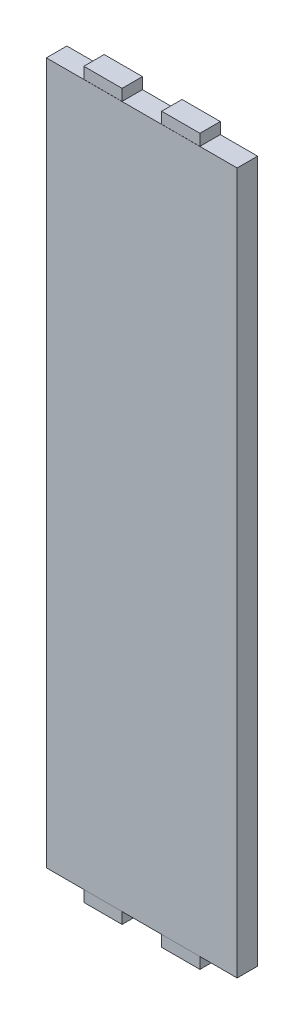
ISO-10303-21;
HEADER;
FILE_DESCRIPTION(('STEP AP214'),'2;1');
FILE_NAME('part.step','',(''),(''),'','','');
FILE_SCHEMA(('AUTOMOTIVE_DESIGN { 1 0 10303 214 1 1 1 1 }'));
ENDSEC;
DATA;
#1=APPLICATION_CONTEXT('core data for automotive mechanical design processes');
#2=APPLICATION_PROTOCOL_DEFINITION('international standard','automotive_design',2000,#1);
#3=PRODUCT_CONTEXT('',#1,'mechanical');
#4=PRODUCT('Part','Part','',(#3));
#5=PRODUCT_RELATED_PRODUCT_CATEGORY('part','',(#4));
#6=PRODUCT_DEFINITION_FORMATION('','',#4);
#7=PRODUCT_DEFINITION_CONTEXT('part definition',#1,'design');
#8=PRODUCT_DEFINITION('design','',#6,#7);
#9=PRODUCT_DEFINITION_SHAPE('','',#8);
#10=(LENGTH_UNIT() NAMED_UNIT(*) SI_UNIT(.MILLI.,.METRE.));
#11=(NAMED_UNIT(*) PLANE_ANGLE_UNIT() SI_UNIT($,.RADIAN.));
#12=(NAMED_UNIT(*) SI_UNIT($,.STERADIAN.) SOLID_ANGLE_UNIT());
#13=UNCERTAINTY_MEASURE_WITH_UNIT(LENGTH_MEASURE(1.E-05),#10,'distance_accuracy_value','');
#14=(GEOMETRIC_REPRESENTATION_CONTEXT(3) GLOBAL_UNCERTAINTY_ASSIGNED_CONTEXT((#13)) GLOBAL_UNIT_ASSIGNED_CONTEXT((#10,
#11,#12)) REPRESENTATION_CONTEXT('',''));
#15=CARTESIAN_POINT('',(0.,0.,0.));
#16=DIRECTION('',(0.,0.,1.));
#17=DIRECTION('',(1.,0.,0.));
#18=AXIS2_PLACEMENT_3D('',#15,#16,#17);
#19=CARTESIAN_POINT('',(0.,0.,-0.1));
#20=DIRECTION('',(0.,0.,-1.));
#21=DIRECTION('',(-1.,0.,0.));
#22=AXIS2_PLACEMENT_3D('',#19,#20,#21);
#23=PLANE('',#22);
#24=CARTESIAN_POINT('',(20.2,478.5,-0.100000000000001));
#25=DIRECTION('',(0.,0.,-1.));
#26=DIRECTION('',(-1.,0.,0.));
#27=AXIS2_PLACEMENT_3D('',#24,#25,#26);
#28=CIRCLE('',#27,1.49999999999999);
#29=CARTESIAN_POINT('',(18.7,478.5,-0.100000000000001));
#30=VERTEX_POINT('',#29);
#31=EDGE_CURVE('E204',#30,#30,#28,.T.);
#32=ORIENTED_EDGE('',*,*,#31,.F.);
#33=EDGE_LOOP('',(#32));
#34=FACE_BOUND('',#33,.T.);
#35=CARTESIAN_POINT('',(173.8,478.5,-0.100000000000001));
#36=DIRECTION('',(0.,0.,-1.));
#37=DIRECTION('',(-1.,0.,0.));
#38=AXIS2_PLACEMENT_3D('',#35,#36,#37);
#39=CIRCLE('',#38,1.5);
#40=CARTESIAN_POINT('',(172.3,478.5,-0.100000000000001));
#41=VERTEX_POINT('',#40);
#42=EDGE_CURVE('E203',#41,#41,#39,.T.);
#43=ORIENTED_EDGE('',*,*,#42,.F.);
#44=EDGE_LOOP('',(#43));
#45=FACE_BOUND('',#44,.T.);
#46=CARTESIAN_POINT('',(173.8,190.5,-0.100000000000001));
#47=DIRECTION('',(0.,0.,-1.));
#48=DIRECTION('',(-1.,0.,0.));
#49=AXIS2_PLACEMENT_3D('',#46,#47,#48);
#50=CIRCLE('',#49,1.5);
#51=CARTESIAN_POINT('',(172.3,190.5,-0.100000000000001));
#52=VERTEX_POINT('',#51);
#53=EDGE_CURVE('E217',#52,#52,#50,.T.);
#54=ORIENTED_EDGE('',*,*,#53,.F.);
#55=EDGE_LOOP('',(#54));
#56=FACE_BOUND('',#55,.T.);
#57=CARTESIAN_POINT('',(20.2,190.5,-0.100000000000001));
#58=DIRECTION('',(0.,0.,-1.));
#59=DIRECTION('',(-1.,0.,0.));
#60=AXIS2_PLACEMENT_3D('',#57,#58,#59);
#61=CIRCLE('',#60,1.49999999999999);
#62=CARTESIAN_POINT('',(18.7,190.5,-0.100000000000001));
#63=VERTEX_POINT('',#62);
#64=EDGE_CURVE('E225',#63,#63,#61,.T.);
#65=ORIENTED_EDGE('',*,*,#64,.F.);
#66=EDGE_LOOP('',(#65));
#67=FACE_BOUND('',#66,.T.);
#68=CARTESIAN_POINT('',(20.2,-1.50000000000006,-0.100000000000001));
#69=DIRECTION('',(0.,0.,-1.));
#70=DIRECTION('',(-1.,0.,0.));
#71=AXIS2_PLACEMENT_3D('',#68,#69,#70);
#72=CIRCLE('',#71,1.49999999999999);
#73=CARTESIAN_POINT('',(18.7,-1.50000000000006,-0.100000000000001));
#74=VERTEX_POINT('',#73);
#75=EDGE_CURVE('E233',#74,#74,#72,.T.);
#76=ORIENTED_EDGE('',*,*,#75,.F.);
#77=EDGE_LOOP('',(#76));
#78=FACE_BOUND('',#77,.T.);
#79=CARTESIAN_POINT('',(173.8,-1.50000000000017,-0.100000000000001));
#80=DIRECTION('',(0.,0.,-1.));
#81=DIRECTION('',(-1.,0.,0.));
#82=AXIS2_PLACEMENT_3D('',#79,#80,#81);
#83=CIRCLE('',#82,1.5);
#84=CARTESIAN_POINT('',(172.3,-1.50000000000017,-0.100000000000001));
#85=VERTEX_POINT('',#84);
#86=EDGE_CURVE('E241',#85,#85,#83,.T.);
#87=ORIENTED_EDGE('',*,*,#86,.F.);
#88=EDGE_LOOP('',(#87));
#89=FACE_BOUND('',#88,.T.);
#90=DIRECTION('',(0.,-1.,0.));
#91=VECTOR('',#90,1.);
#92=CARTESIAN_POINT('',(12.7,-36.5,-0.1));
#93=LINE('',#92,#91);
#94=CARTESIAN_POINT('',(12.7,593.5,-0.0999999999999501));
#95=VERTEX_POINT('',#94);
#96=CARTESIAN_POINT('',(12.7,-26.5,-0.100000000000004));
#97=VERTEX_POINT('',#96);
#98=EDGE_CURVE('E422',#95,#97,#93,.T.);
#99=ORIENTED_EDGE('',*,*,#98,.F.);
#100=DIRECTION('',(1.,0.,0.));
#101=VECTOR('',#100,1.);
#102=CARTESIAN_POINT('',(12.7,593.5,-0.0999999999999501));
#103=LINE('',#102,#101);
#104=CARTESIAN_POINT('',(45.7000000000001,593.5,-0.0999999999999945));
#105=VERTEX_POINT('',#104);
#106=EDGE_CURVE('E328',#95,#105,#103,.T.);
#107=ORIENTED_EDGE('',*,*,#106,.T.);
#108=DIRECTION('',(0.,-1.,0.));
#109=VECTOR('',#108,1.);
#110=CARTESIAN_POINT('',(45.7000000000001,631.5,-0.0999999999999945));
#111=LINE('',#110,#109);
#112=CARTESIAN_POINT('',(45.7000000000001,603.5,-0.0999999999999945));
#113=VERTEX_POINT('',#112);
#114=EDGE_CURVE('E287',#113,#105,#111,.T.);
#115=ORIENTED_EDGE('',*,*,#114,.F.);
#116=DIRECTION('',(-1.,0.,0.));
#117=VECTOR('',#116,1.);
#118=CARTESIAN_POINT('',(12.7,603.5,-0.1));
#119=LINE('',#118,#117);
#120=CARTESIAN_POINT('',(79.5000000000001,603.5,-0.0999999999999947));
#121=VERTEX_POINT('',#120);
#122=EDGE_CURVE('E434',#121,#113,#119,.T.);
#123=ORIENTED_EDGE('',*,*,#122,.F.);
#124=DIRECTION('',(0.,-1.,0.));
#125=VECTOR('',#124,1.);
#126=CARTESIAN_POINT('',(79.5000000000001,631.5,-0.0999999999999947));
#127=LINE('',#126,#125);
#128=CARTESIAN_POINT('',(79.5000000000001,593.5,-0.09999999999995));
#129=VERTEX_POINT('',#128);
#130=EDGE_CURVE('E295',#121,#129,#127,.T.);
#131=ORIENTED_EDGE('',*,*,#130,.T.);
#132=CARTESIAN_POINT('',(114.5,593.5,-0.100000000000004));
#133=VERTEX_POINT('',#132);
#134=EDGE_CURVE('E332',#129,#133,#103,.T.);
#135=ORIENTED_EDGE('',*,*,#134,.T.);
#136=DIRECTION('',(0.,-1.,0.));
#137=VECTOR('',#136,1.);
#138=CARTESIAN_POINT('',(114.5,631.5,-0.100000000000004));
#139=LINE('',#138,#137);
#140=CARTESIAN_POINT('',(114.5,603.5,-0.100000000000004));
#141=VERTEX_POINT('',#140);
#142=EDGE_CURVE('E261',#141,#133,#139,.T.);
#143=ORIENTED_EDGE('',*,*,#142,.F.);
#144=CARTESIAN_POINT('',(148.3,603.5,-0.100000000000004));
#145=VERTEX_POINT('',#144);
#146=EDGE_CURVE('E437',#145,#141,#119,.T.);
#147=ORIENTED_EDGE('',*,*,#146,.F.);
#148=DIRECTION('',(0.,-1.,0.));
#149=VECTOR('',#148,1.);
#150=CARTESIAN_POINT('',(148.3,631.5,-0.100000000000004));
#151=LINE('',#150,#149);
#152=CARTESIAN_POINT('',(148.3,593.5,-0.09999999999995));
#153=VERTEX_POINT('',#152);
#154=EDGE_CURVE('E269',#145,#153,#151,.T.);
#155=ORIENTED_EDGE('',*,*,#154,.T.);
#156=CARTESIAN_POINT('',(181.3,593.5,-0.09999999999995));
#157=VERTEX_POINT('',#156);
#158=EDGE_CURVE('E327',#153,#157,#103,.T.);
#159=ORIENTED_EDGE('',*,*,#158,.T.);
#160=DIRECTION('',(0.,1.,0.));
#161=VECTOR('',#160,1.);
#162=CARTESIAN_POINT('',(181.3,-36.5,-0.1));
#163=LINE('',#162,#161);
#164=CARTESIAN_POINT('',(181.3,-26.5,-0.0999999999999822));
#165=VERTEX_POINT('',#164);
#166=EDGE_CURVE('E430',#165,#157,#163,.T.);
#167=ORIENTED_EDGE('',*,*,#166,.F.);
#168=DIRECTION('',(1.,0.,0.));
#169=VECTOR('',#168,1.);
#170=CARTESIAN_POINT('',(12.7,-26.5,-0.100000000000004));
#171=LINE('',#170,#169);
#172=CARTESIAN_POINT('',(148.3,-26.5,-0.10000000000004));
#173=VERTEX_POINT('',#172);
#174=EDGE_CURVE('E408',#173,#165,#171,.T.);
#175=ORIENTED_EDGE('',*,*,#174,.F.);
#176=DIRECTION('',(0.,-1.,0.));
#177=VECTOR('',#176,1.);
#178=CARTESIAN_POINT('',(148.3,1.50000000000003,-0.10000000000004));
#179=LINE('',#178,#177);
#180=CARTESIAN_POINT('',(148.3,-36.5,-0.0999999999999865));
#181=VERTEX_POINT('',#180);
#182=EDGE_CURVE('E356',#173,#181,#179,.T.);
#183=ORIENTED_EDGE('',*,*,#182,.T.);
#184=DIRECTION('',(1.,0.,0.));
#185=VECTOR('',#184,1.);
#186=CARTESIAN_POINT('',(12.7,-36.5,-0.1));
#187=LINE('',#186,#185);
#188=CARTESIAN_POINT('',(114.5,-36.5,-0.100000000000044));
#189=VERTEX_POINT('',#188);
#190=EDGE_CURVE('E425',#189,#181,#187,.T.);
#191=ORIENTED_EDGE('',*,*,#190,.F.);
#192=DIRECTION('',(0.,-1.,0.));
#193=VECTOR('',#192,1.);
#194=CARTESIAN_POINT('',(114.5,1.50000000000003,-0.100000000000044));
#195=LINE('',#194,#193);
#196=CARTESIAN_POINT('',(114.5,-26.5,-0.100000000000044));
#197=VERTEX_POINT('',#196);
#198=EDGE_CURVE('E348',#197,#189,#195,.T.);
#199=ORIENTED_EDGE('',*,*,#198,.F.);
#200=CARTESIAN_POINT('',(79.5,-26.5,-0.10000000000004));
#201=VERTEX_POINT('',#200);
#202=EDGE_CURVE('E413',#201,#197,#171,.T.);
#203=ORIENTED_EDGE('',*,*,#202,.F.);
#204=DIRECTION('',(0.,-1.,0.));
#205=VECTOR('',#204,1.);
#206=CARTESIAN_POINT('',(79.5,1.50000000000003,-0.10000000000004));
#207=LINE('',#206,#205);
#208=CARTESIAN_POINT('',(79.5,-36.5,-0.0999999999999953));
#209=VERTEX_POINT('',#208);
#210=EDGE_CURVE('E381',#201,#209,#207,.T.);
#211=ORIENTED_EDGE('',*,*,#210,.T.);
#212=CARTESIAN_POINT('',(45.7,-36.5,-0.100000000000044));
#213=VERTEX_POINT('',#212);
#214=EDGE_CURVE('E429',#213,#209,#187,.T.);
#215=ORIENTED_EDGE('',*,*,#214,.F.);
#216=DIRECTION('',(0.,-1.,0.));
#217=VECTOR('',#216,1.);
#218=CARTESIAN_POINT('',(45.7,1.50000000000003,-0.100000000000044));
#219=LINE('',#218,#217);
#220=CARTESIAN_POINT('',(45.7,-26.5,-0.100000000000044));
#221=VERTEX_POINT('',#220);
#222=EDGE_CURVE('E373',#221,#213,#219,.T.);
#223=ORIENTED_EDGE('',*,*,#222,.F.);
#224=EDGE_CURVE('E409',#97,#221,#171,.T.);
#225=ORIENTED_EDGE('',*,*,#224,.F.);
#226=EDGE_LOOP('',(#99,#107,#115,#123,#131,#135,#143,#147,#155,#159,#167,#175,#183,#191,#199,
#203,#211,#215,#223,#225));
#227=FACE_BOUND('',#226,.T.);
#228=ADVANCED_FACE('F39',(#34,#45,#56,#67,#78,#89,#227),#23,.T.);
#229=CARTESIAN_POINT('',(12.7,-36.5,-0.1));
#230=DIRECTION('',(-1.,0.,0.));
#231=DIRECTION('',(0.,-1.,0.));
#232=AXIS2_PLACEMENT_3D('',#229,#230,#231);
#233=PLANE('',#232);
#234=DIRECTION('',(0.,-1.,0.));
#235=VECTOR('',#234,1.);
#236=CARTESIAN_POINT('',(12.7,-36.5,18.));
#237=LINE('',#236,#235);
#238=CARTESIAN_POINT('',(12.7,593.5,18.));
#239=VERTEX_POINT('',#238);
#240=CARTESIAN_POINT('',(12.7,-26.5,18.));
#241=VERTEX_POINT('',#240);
#242=EDGE_CURVE('E416',#239,#241,#237,.T.);
#243=ORIENTED_EDGE('',*,*,#242,.F.);
#244=DIRECTION('',(0.,0.,-1.));
#245=VECTOR('',#244,1.);
#246=CARTESIAN_POINT('',(12.7000000000001,593.5,35.2599999999997));
#247=LINE('',#246,#245);
#248=EDGE_CURVE('E54',#239,#95,#247,.T.);
#249=ORIENTED_EDGE('',*,*,#248,.T.);
#250=ORIENTED_EDGE('',*,*,#98,.T.);
#251=DIRECTION('',(0.,0.,-1.));
#252=VECTOR('',#251,1.);
#253=CARTESIAN_POINT('',(12.7,-26.5,35.2599999999996));
#254=LINE('',#253,#252);
#255=EDGE_CURVE('E404',#241,#97,#254,.T.);
#256=ORIENTED_EDGE('',*,*,#255,.F.);
#257=EDGE_LOOP('',(#243,#249,#250,#256));
#258=FACE_BOUND('',#257,.T.);
#259=ADVANCED_FACE('F41',(#258),#233,.T.);
#260=CARTESIAN_POINT('',(12.7,603.5,-0.1));
#261=DIRECTION('',(0.,1.,0.));
#262=DIRECTION('',(0.,0.,1.));
#263=AXIS2_PLACEMENT_3D('',#260,#261,#262);
#264=PLANE('',#263);
#265=ORIENTED_EDGE('',*,*,#122,.T.);
#266=DIRECTION('',(0.,0.,1.));
#267=VECTOR('',#266,1.);
#268=CARTESIAN_POINT('',(45.7000000000001,603.5,-0.0999999999999949));
#269=LINE('',#268,#267);
#270=CARTESIAN_POINT('',(45.7000000000001,603.5,17.9));
#271=VERTEX_POINT('',#270);
#272=EDGE_CURVE('E309',#113,#271,#269,.T.);
#273=ORIENTED_EDGE('',*,*,#272,.T.);
#274=DIRECTION('',(1.,0.,0.));
#275=VECTOR('',#274,1.);
#276=CARTESIAN_POINT('',(0.,603.5,17.9));
#277=LINE('',#276,#275);
#278=CARTESIAN_POINT('',(79.5000000000001,603.5,17.9));
#279=VERTEX_POINT('',#278);
#280=EDGE_CURVE('E305',#271,#279,#277,.T.);
#281=ORIENTED_EDGE('',*,*,#280,.T.);
#282=DIRECTION('',(0.,0.,-1.));
#283=VECTOR('',#282,1.);
#284=CARTESIAN_POINT('',(79.5000000000001,603.5,-0.0999999999999992));
#285=LINE('',#284,#283);
#286=EDGE_CURVE('E291',#279,#121,#285,.T.);
#287=ORIENTED_EDGE('',*,*,#286,.T.);
#288=EDGE_LOOP('',(#265,#273,#281,#287));
#289=FACE_BOUND('',#288,.T.);
#290=ADVANCED_FACE('F534',(#289),#264,.T.);
#291=ORIENTED_EDGE('',*,*,#146,.T.);
#292=DIRECTION('',(0.,0.,1.));
#293=VECTOR('',#292,1.);
#294=CARTESIAN_POINT('',(114.5,603.5,-0.100000000000004));
#295=LINE('',#294,#293);
#296=CARTESIAN_POINT('',(114.5,603.5,17.9));
#297=VERTEX_POINT('',#296);
#298=EDGE_CURVE('E321',#141,#297,#295,.T.);
#299=ORIENTED_EDGE('',*,*,#298,.T.);
#300=DIRECTION('',(1.,0.,0.));
#301=VECTOR('',#300,1.);
#302=CARTESIAN_POINT('',(0.,603.5,17.9));
#303=LINE('',#302,#301);
#304=CARTESIAN_POINT('',(148.3,603.5,17.9));
#305=VERTEX_POINT('',#304);
#306=EDGE_CURVE('E317',#297,#305,#303,.T.);
#307=ORIENTED_EDGE('',*,*,#306,.T.);
#308=DIRECTION('',(0.,0.,-1.));
#309=VECTOR('',#308,1.);
#310=CARTESIAN_POINT('',(148.3,603.5,-0.100000000000008));
#311=LINE('',#310,#309);
#312=EDGE_CURVE('E313',#305,#145,#311,.T.);
#313=ORIENTED_EDGE('',*,*,#312,.T.);
#314=EDGE_LOOP('',(#291,#299,#307,#313));
#315=FACE_BOUND('',#314,.T.);
#316=ADVANCED_FACE('F443',(#315),#264,.T.);
#317=CARTESIAN_POINT('',(181.3,-36.5,-0.1));
#318=DIRECTION('',(1.,0.,0.));
#319=DIRECTION('',(0.,0.,-1.));
#320=AXIS2_PLACEMENT_3D('',#317,#318,#319);
#321=PLANE('',#320);
#322=ORIENTED_EDGE('',*,*,#166,.T.);
#323=DIRECTION('',(0.,0.,1.));
#324=VECTOR('',#323,1.);
#325=CARTESIAN_POINT('',(181.3,593.5,-0.09999999999995));
#326=LINE('',#325,#324);
#327=CARTESIAN_POINT('',(181.3,593.5,18.));
#328=VERTEX_POINT('',#327);
#329=EDGE_CURVE('E331',#157,#328,#326,.T.);
#330=ORIENTED_EDGE('',*,*,#329,.T.);
#331=DIRECTION('',(0.,1.,0.));
#332=VECTOR('',#331,1.);
#333=CARTESIAN_POINT('',(181.3,-36.5,18.));
#334=LINE('',#333,#332);
#335=CARTESIAN_POINT('',(181.3,-26.5,18.));
#336=VERTEX_POINT('',#335);
#337=EDGE_CURVE('E419',#336,#328,#334,.T.);
#338=ORIENTED_EDGE('',*,*,#337,.F.);
#339=DIRECTION('',(0.,0.,1.));
#340=VECTOR('',#339,1.);
#341=CARTESIAN_POINT('',(181.3,-26.5,-0.0999999999999822));
#342=LINE('',#341,#340);
#343=EDGE_CURVE('E412',#165,#336,#342,.T.);
#344=ORIENTED_EDGE('',*,*,#343,.F.);
#345=EDGE_LOOP('',(#322,#330,#338,#344));
#346=FACE_BOUND('',#345,.T.);
#347=ADVANCED_FACE('F500',(#346),#321,.T.);
#348=CARTESIAN_POINT('',(0.,0.,18.));
#349=DIRECTION('',(0.,0.,-1.));
#350=DIRECTION('',(-1.,0.,0.));
#351=AXIS2_PLACEMENT_3D('',#348,#349,#350);
#352=PLANE('',#351);
#353=DIRECTION('',(1.,0.,0.));
#354=VECTOR('',#353,1.);
#355=CARTESIAN_POINT('',(1.97675209534509E-13,593.5,18.));
#356=LINE('',#355,#354);
#357=EDGE_CURVE('E11',#239,#328,#356,.T.);
#358=ORIENTED_EDGE('',*,*,#357,.F.);
#359=ORIENTED_EDGE('',*,*,#242,.T.);
#360=DIRECTION('',(1.,0.,0.));
#361=VECTOR('',#360,1.);
#362=CARTESIAN_POINT('',(0.,-26.5,18.));
#363=LINE('',#362,#361);
#364=EDGE_CURVE('E48',#241,#336,#363,.T.);
#365=ORIENTED_EDGE('',*,*,#364,.T.);
#366=ORIENTED_EDGE('',*,*,#337,.T.);
#367=EDGE_LOOP('',(#358,#359,#365,#366));
#368=FACE_BOUND('',#367,.T.);
#369=ADVANCED_FACE('F495',(#368),#352,.F.);
#370=CARTESIAN_POINT('',(12.7,-36.5,-0.1));
#371=DIRECTION('',(0.,-1.,0.));
#372=DIRECTION('',(0.,0.,-1.));
#373=AXIS2_PLACEMENT_3D('',#370,#371,#372);
#374=PLANE('',#373);
#375=DIRECTION('',(-1.,0.,0.));
#376=VECTOR('',#375,1.);
#377=CARTESIAN_POINT('',(45.7,-36.5,17.9));
#378=LINE('',#377,#376);
#379=CARTESIAN_POINT('',(79.5,-36.5,17.9));
#380=VERTEX_POINT('',#379);
#381=CARTESIAN_POINT('',(45.7,-36.5,17.9));
#382=VERTEX_POINT('',#381);
#383=EDGE_CURVE('E369',#380,#382,#378,.T.);
#384=ORIENTED_EDGE('',*,*,#383,.T.);
#385=DIRECTION('',(0.,0.,-1.));
#386=VECTOR('',#385,1.);
#387=CARTESIAN_POINT('',(45.7,-36.5,-0.100000000000044));
#388=LINE('',#387,#386);
#389=EDGE_CURVE('E352',#382,#213,#388,.T.);
#390=ORIENTED_EDGE('',*,*,#389,.T.);
#391=ORIENTED_EDGE('',*,*,#214,.T.);
#392=DIRECTION('',(0.,0.,1.));
#393=VECTOR('',#392,1.);
#394=CARTESIAN_POINT('',(79.5,-36.5,-0.10000000000004));
#395=LINE('',#394,#393);
#396=EDGE_CURVE('E365',#209,#380,#395,.T.);
#397=ORIENTED_EDGE('',*,*,#396,.T.);
#398=EDGE_LOOP('',(#384,#390,#391,#397));
#399=FACE_BOUND('',#398,.T.);
#400=ADVANCED_FACE('F470',(#399),#374,.T.);
#401=DIRECTION('',(-1.,0.,0.));
#402=VECTOR('',#401,1.);
#403=CARTESIAN_POINT('',(114.5,-36.5,17.9));
#404=LINE('',#403,#402);
#405=CARTESIAN_POINT('',(148.3,-36.5,17.9));
#406=VERTEX_POINT('',#405);
#407=CARTESIAN_POINT('',(114.5,-36.5,17.9));
#408=VERTEX_POINT('',#407);
#409=EDGE_CURVE('E344',#406,#408,#404,.T.);
#410=ORIENTED_EDGE('',*,*,#409,.T.);
#411=DIRECTION('',(0.,0.,-1.));
#412=VECTOR('',#411,1.);
#413=CARTESIAN_POINT('',(114.5,-36.5,-0.100000000000044));
#414=LINE('',#413,#412);
#415=EDGE_CURVE('E336',#408,#189,#414,.T.);
#416=ORIENTED_EDGE('',*,*,#415,.T.);
#417=ORIENTED_EDGE('',*,*,#190,.T.);
#418=DIRECTION('',(0.,0.,1.));
#419=VECTOR('',#418,1.);
#420=CARTESIAN_POINT('',(148.3,-36.5,-0.10000000000004));
#421=LINE('',#420,#419);
#422=EDGE_CURVE('E340',#181,#406,#421,.T.);
#423=ORIENTED_EDGE('',*,*,#422,.T.);
#424=EDGE_LOOP('',(#410,#416,#417,#423));
#425=FACE_BOUND('',#424,.T.);
#426=ADVANCED_FACE('F506',(#425),#374,.T.);
#427=CARTESIAN_POINT('',(-1.11022302462516E-13,-26.5,-0.100000000000044));
#428=DIRECTION('',(0.,1.,0.));
#429=DIRECTION('',(1.,0.,0.));
#430=AXIS2_PLACEMENT_3D('',#427,#428,#429);
#431=PLANE('',#430);
#432=ORIENTED_EDGE('',*,*,#224,.T.);
#433=DIRECTION('',(0.,0.,1.));
#434=VECTOR('',#433,1.);
#435=CARTESIAN_POINT('',(45.7,-26.5,-0.100000000000044));
#436=LINE('',#435,#434);
#437=CARTESIAN_POINT('',(45.7,-26.5,17.9));
#438=VERTEX_POINT('',#437);
#439=EDGE_CURVE('E392',#221,#438,#436,.T.);
#440=ORIENTED_EDGE('',*,*,#439,.T.);
#441=DIRECTION('',(1.,0.,0.));
#442=VECTOR('',#441,1.);
#443=CARTESIAN_POINT('',(-1.11022302462827E-13,-26.5,17.9));
#444=LINE('',#443,#442);
#445=CARTESIAN_POINT('',(79.5,-26.5,17.9));
#446=VERTEX_POINT('',#445);
#447=EDGE_CURVE('E389',#438,#446,#444,.T.);
#448=ORIENTED_EDGE('',*,*,#447,.T.);
#449=DIRECTION('',(0.,0.,-1.));
#450=VECTOR('',#449,1.);
#451=CARTESIAN_POINT('',(79.5,-26.5,-0.100000000000044));
#452=LINE('',#451,#450);
#453=EDGE_CURVE('E377',#446,#201,#452,.T.);
#454=ORIENTED_EDGE('',*,*,#453,.T.);
#455=ORIENTED_EDGE('',*,*,#202,.T.);
#456=DIRECTION('',(0.,0.,1.));
#457=VECTOR('',#456,1.);
#458=CARTESIAN_POINT('',(114.5,-26.5,-0.100000000000044));
#459=LINE('',#458,#457);
#460=CARTESIAN_POINT('',(114.5,-26.5,17.9));
#461=VERTEX_POINT('',#460);
#462=EDGE_CURVE('E401',#197,#461,#459,.T.);
#463=ORIENTED_EDGE('',*,*,#462,.T.);
#464=DIRECTION('',(1.,0.,0.));
#465=VECTOR('',#464,1.);
#466=CARTESIAN_POINT('',(-1.11022302462827E-13,-26.5,17.9));
#467=LINE('',#466,#465);
#468=CARTESIAN_POINT('',(148.3,-26.5,17.9));
#469=VERTEX_POINT('',#468);
#470=EDGE_CURVE('E398',#461,#469,#467,.T.);
#471=ORIENTED_EDGE('',*,*,#470,.T.);
#472=DIRECTION('',(0.,0.,-1.));
#473=VECTOR('',#472,1.);
#474=CARTESIAN_POINT('',(148.3,-26.5,-0.100000000000044));
#475=LINE('',#474,#473);
#476=EDGE_CURVE('E395',#469,#173,#475,.T.);
#477=ORIENTED_EDGE('',*,*,#476,.T.);
#478=ORIENTED_EDGE('',*,*,#174,.T.);
#479=ORIENTED_EDGE('',*,*,#343,.T.);
#480=ORIENTED_EDGE('',*,*,#364,.F.);
#481=ORIENTED_EDGE('',*,*,#255,.T.);
#482=EDGE_LOOP('',(#432,#440,#448,#454,#455,#463,#471,#477,#478,#479,#480,#481));
#483=FACE_BOUND('',#482,.T.);
#484=ADVANCED_FACE('F490',(#483),#431,.F.);
#485=CARTESIAN_POINT('',(45.7,1.50000000000003,-0.100000000000044));
#486=DIRECTION('',(-1.,0.,0.));
#487=DIRECTION('',(0.,1.,0.));
#488=AXIS2_PLACEMENT_3D('',#485,#486,#487);
#489=PLANE('',#488);
#490=ORIENTED_EDGE('',*,*,#439,.F.);
#491=ORIENTED_EDGE('',*,*,#222,.T.);
#492=ORIENTED_EDGE('',*,*,#389,.F.);
#493=DIRECTION('',(0.,-1.,0.));
#494=VECTOR('',#493,1.);
#495=CARTESIAN_POINT('',(45.7,1.50000000000003,17.9));
#496=LINE('',#495,#494);
#497=EDGE_CURVE('E374',#438,#382,#496,.T.);
#498=ORIENTED_EDGE('',*,*,#497,.F.);
#499=EDGE_LOOP('',(#490,#491,#492,#498));
#500=FACE_BOUND('',#499,.T.);
#501=ADVANCED_FACE('F488',(#500),#489,.T.);
#502=CARTESIAN_POINT('',(45.7,1.50000000000003,17.9));
#503=DIRECTION('',(0.,0.,1.));
#504=DIRECTION('',(0.,1.,0.));
#505=AXIS2_PLACEMENT_3D('',#502,#503,#504);
#506=PLANE('',#505);
#507=ORIENTED_EDGE('',*,*,#447,.F.);
#508=ORIENTED_EDGE('',*,*,#497,.T.);
#509=ORIENTED_EDGE('',*,*,#383,.F.);
#510=DIRECTION('',(0.,-1.,0.));
#511=VECTOR('',#510,1.);
#512=CARTESIAN_POINT('',(79.5,1.50000000000003,17.9));
#513=LINE('',#512,#511);
#514=EDGE_CURVE('E378',#446,#380,#513,.T.);
#515=ORIENTED_EDGE('',*,*,#514,.F.);
#516=EDGE_LOOP('',(#507,#508,#509,#515));
#517=FACE_BOUND('',#516,.T.);
#518=ADVANCED_FACE('F484',(#517),#506,.T.);
#519=CARTESIAN_POINT('',(79.5,1.50000000000003,-0.10000000000004));
#520=DIRECTION('',(1.,0.,0.));
#521=DIRECTION('',(0.,-1.,0.));
#522=AXIS2_PLACEMENT_3D('',#519,#520,#521);
#523=PLANE('',#522);
#524=ORIENTED_EDGE('',*,*,#453,.F.);
#525=ORIENTED_EDGE('',*,*,#514,.T.);
#526=ORIENTED_EDGE('',*,*,#396,.F.);
#527=ORIENTED_EDGE('',*,*,#210,.F.);
#528=EDGE_LOOP('',(#524,#525,#526,#527));
#529=FACE_BOUND('',#528,.T.);
#530=ADVANCED_FACE('F479',(#529),#523,.T.);
#531=CARTESIAN_POINT('',(114.5,1.50000000000003,-0.100000000000044));
#532=DIRECTION('',(-1.,0.,0.));
#533=DIRECTION('',(0.,1.,0.));
#534=AXIS2_PLACEMENT_3D('',#531,#532,#533);
#535=PLANE('',#534);
#536=ORIENTED_EDGE('',*,*,#462,.F.);
#537=ORIENTED_EDGE('',*,*,#198,.T.);
#538=ORIENTED_EDGE('',*,*,#415,.F.);
#539=DIRECTION('',(0.,-1.,0.));
#540=VECTOR('',#539,1.);
#541=CARTESIAN_POINT('',(114.5,1.50000000000003,17.9));
#542=LINE('',#541,#540);
#543=EDGE_CURVE('E349',#461,#408,#542,.T.);
#544=ORIENTED_EDGE('',*,*,#543,.F.);
#545=EDGE_LOOP('',(#536,#537,#538,#544));
#546=FACE_BOUND('',#545,.T.);
#547=ADVANCED_FACE('F512',(#546),#535,.T.);
#548=CARTESIAN_POINT('',(114.5,1.50000000000003,17.9));
#549=DIRECTION('',(0.,0.,1.));
#550=DIRECTION('',(0.,1.,0.));
#551=AXIS2_PLACEMENT_3D('',#548,#549,#550);
#552=PLANE('',#551);
#553=ORIENTED_EDGE('',*,*,#470,.F.);
#554=ORIENTED_EDGE('',*,*,#543,.T.);
#555=ORIENTED_EDGE('',*,*,#409,.F.);
#556=DIRECTION('',(0.,-1.,0.));
#557=VECTOR('',#556,1.);
#558=CARTESIAN_POINT('',(148.3,1.50000000000003,17.9));
#559=LINE('',#558,#557);
#560=EDGE_CURVE('E353',#469,#406,#559,.T.);
#561=ORIENTED_EDGE('',*,*,#560,.F.);
#562=EDGE_LOOP('',(#553,#554,#555,#561));
#563=FACE_BOUND('',#562,.T.);
#564=ADVANCED_FACE('F516',(#563),#552,.T.);
#565=CARTESIAN_POINT('',(148.3,1.50000000000003,-0.10000000000004));
#566=DIRECTION('',(1.,0.,0.));
#567=DIRECTION('',(0.,-1.,0.));
#568=AXIS2_PLACEMENT_3D('',#565,#566,#567);
#569=PLANE('',#568);
#570=ORIENTED_EDGE('',*,*,#476,.F.);
#571=ORIENTED_EDGE('',*,*,#560,.T.);
#572=ORIENTED_EDGE('',*,*,#422,.F.);
#573=ORIENTED_EDGE('',*,*,#182,.F.);
#574=EDGE_LOOP('',(#570,#571,#572,#573));
#575=FACE_BOUND('',#574,.T.);
#576=ADVANCED_FACE('F517',(#575),#569,.T.);
#577=CARTESIAN_POINT('',(0.,593.5,-0.099999999999989));
#578=DIRECTION('',(0.,1.,0.));
#579=DIRECTION('',(1.,0.,0.));
#580=AXIS2_PLACEMENT_3D('',#577,#578,#579);
#581=PLANE('',#580);
#582=ORIENTED_EDGE('',*,*,#357,.T.);
#583=ORIENTED_EDGE('',*,*,#329,.F.);
#584=ORIENTED_EDGE('',*,*,#158,.F.);
#585=DIRECTION('',(0.,0.,1.));
#586=VECTOR('',#585,1.);
#587=CARTESIAN_POINT('',(148.3,593.5,-0.100000000000004));
#588=LINE('',#587,#586);
#589=CARTESIAN_POINT('',(148.3,593.5,17.9));
#590=VERTEX_POINT('',#589);
#591=EDGE_CURVE('E253',#153,#590,#588,.T.);
#592=ORIENTED_EDGE('',*,*,#591,.T.);
#593=DIRECTION('',(-1.,0.,0.));
#594=VECTOR('',#593,1.);
#595=CARTESIAN_POINT('',(114.5,593.5,17.9));
#596=LINE('',#595,#594);
#597=CARTESIAN_POINT('',(114.5,593.5,17.9));
#598=VERTEX_POINT('',#597);
#599=EDGE_CURVE('E257',#590,#598,#596,.T.);
#600=ORIENTED_EDGE('',*,*,#599,.T.);
#601=DIRECTION('',(0.,0.,-1.));
#602=VECTOR('',#601,1.);
#603=CARTESIAN_POINT('',(114.5,593.5,-0.100000000000004));
#604=LINE('',#603,#602);
#605=EDGE_CURVE('E249',#598,#133,#604,.T.);
#606=ORIENTED_EDGE('',*,*,#605,.T.);
#607=ORIENTED_EDGE('',*,*,#134,.F.);
#608=DIRECTION('',(0.,0.,1.));
#609=VECTOR('',#608,1.);
#610=CARTESIAN_POINT('',(79.5000000000001,593.5,-0.0999999999999947));
#611=LINE('',#610,#609);
#612=CARTESIAN_POINT('',(79.5000000000001,593.5,17.9));
#613=VERTEX_POINT('',#612);
#614=EDGE_CURVE('E279',#129,#613,#611,.T.);
#615=ORIENTED_EDGE('',*,*,#614,.T.);
#616=DIRECTION('',(-1.,0.,0.));
#617=VECTOR('',#616,1.);
#618=CARTESIAN_POINT('',(45.7000000000001,593.5,17.9));
#619=LINE('',#618,#617);
#620=CARTESIAN_POINT('',(45.7000000000001,593.5,17.9));
#621=VERTEX_POINT('',#620);
#622=EDGE_CURVE('E283',#613,#621,#619,.T.);
#623=ORIENTED_EDGE('',*,*,#622,.T.);
#624=DIRECTION('',(0.,0.,-1.));
#625=VECTOR('',#624,1.);
#626=CARTESIAN_POINT('',(45.7000000000001,593.5,-0.0999999999999945));
#627=LINE('',#626,#625);
#628=EDGE_CURVE('E265',#621,#105,#627,.T.);
#629=ORIENTED_EDGE('',*,*,#628,.T.);
#630=ORIENTED_EDGE('',*,*,#106,.F.);
#631=ORIENTED_EDGE('',*,*,#248,.F.);
#632=EDGE_LOOP('',(#582,#583,#584,#592,#600,#606,#607,#615,#623,#629,#630,#631));
#633=FACE_BOUND('',#632,.T.);
#634=ADVANCED_FACE('F460',(#633),#581,.T.);
#635=CARTESIAN_POINT('',(45.7000000000001,631.5,-0.0999999999999945));
#636=DIRECTION('',(-1.,0.,0.));
#637=DIRECTION('',(0.,1.,0.));
#638=AXIS2_PLACEMENT_3D('',#635,#636,#637);
#639=PLANE('',#638);
#640=ORIENTED_EDGE('',*,*,#272,.F.);
#641=ORIENTED_EDGE('',*,*,#114,.T.);
#642=ORIENTED_EDGE('',*,*,#628,.F.);
#643=DIRECTION('',(0.,-1.,0.));
#644=VECTOR('',#643,1.);
#645=CARTESIAN_POINT('',(45.7000000000001,631.5,17.9));
#646=LINE('',#645,#644);
#647=EDGE_CURVE('E288',#271,#621,#646,.T.);
#648=ORIENTED_EDGE('',*,*,#647,.F.);
#649=EDGE_LOOP('',(#640,#641,#642,#648));
#650=FACE_BOUND('',#649,.T.);
#651=ADVANCED_FACE('F524',(#650),#639,.T.);
#652=CARTESIAN_POINT('',(45.7000000000001,631.5,17.9));
#653=DIRECTION('',(0.,0.,1.));
#654=DIRECTION('',(0.,1.,0.));
#655=AXIS2_PLACEMENT_3D('',#652,#653,#654);
#656=PLANE('',#655);
#657=ORIENTED_EDGE('',*,*,#280,.F.);
#658=ORIENTED_EDGE('',*,*,#647,.T.);
#659=ORIENTED_EDGE('',*,*,#622,.F.);
#660=DIRECTION('',(0.,-1.,0.));
#661=VECTOR('',#660,1.);
#662=CARTESIAN_POINT('',(79.5000000000001,631.5,17.9));
#663=LINE('',#662,#661);
#664=EDGE_CURVE('E292',#279,#613,#663,.T.);
#665=ORIENTED_EDGE('',*,*,#664,.F.);
#666=EDGE_LOOP('',(#657,#658,#659,#665));
#667=FACE_BOUND('',#666,.T.);
#668=ADVANCED_FACE('F766',(#667),#656,.T.);
#669=CARTESIAN_POINT('',(79.5000000000001,631.5,-0.0999999999999947));
#670=DIRECTION('',(1.,0.,0.));
#671=DIRECTION('',(0.,-1.,0.));
#672=AXIS2_PLACEMENT_3D('',#669,#670,#671);
#673=PLANE('',#672);
#674=ORIENTED_EDGE('',*,*,#286,.F.);
#675=ORIENTED_EDGE('',*,*,#664,.T.);
#676=ORIENTED_EDGE('',*,*,#614,.F.);
#677=ORIENTED_EDGE('',*,*,#130,.F.);
#678=EDGE_LOOP('',(#674,#675,#676,#677));
#679=FACE_BOUND('',#678,.T.);
#680=ADVANCED_FACE('F758',(#679),#673,.T.);
#681=CARTESIAN_POINT('',(114.5,631.5,-0.100000000000004));
#682=DIRECTION('',(-1.,0.,0.));
#683=DIRECTION('',(0.,1.,0.));
#684=AXIS2_PLACEMENT_3D('',#681,#682,#683);
#685=PLANE('',#684);
#686=ORIENTED_EDGE('',*,*,#298,.F.);
#687=ORIENTED_EDGE('',*,*,#142,.T.);
#688=ORIENTED_EDGE('',*,*,#605,.F.);
#689=DIRECTION('',(0.,-1.,0.));
#690=VECTOR('',#689,1.);
#691=CARTESIAN_POINT('',(114.5,631.5,17.9));
#692=LINE('',#691,#690);
#693=EDGE_CURVE('E262',#297,#598,#692,.T.);
#694=ORIENTED_EDGE('',*,*,#693,.F.);
#695=EDGE_LOOP('',(#686,#687,#688,#694));
#696=FACE_BOUND('',#695,.T.);
#697=ADVANCED_FACE('F451',(#696),#685,.T.);
#698=CARTESIAN_POINT('',(114.5,631.5,17.9));
#699=DIRECTION('',(0.,0.,1.));
#700=DIRECTION('',(0.,1.,0.));
#701=AXIS2_PLACEMENT_3D('',#698,#699,#700);
#702=PLANE('',#701);
#703=ORIENTED_EDGE('',*,*,#306,.F.);
#704=ORIENTED_EDGE('',*,*,#693,.T.);
#705=ORIENTED_EDGE('',*,*,#599,.F.);
#706=DIRECTION('',(0.,-1.,0.));
#707=VECTOR('',#706,1.);
#708=CARTESIAN_POINT('',(148.3,631.5,17.9));
#709=LINE('',#708,#707);
#710=EDGE_CURVE('E266',#305,#590,#709,.T.);
#711=ORIENTED_EDGE('',*,*,#710,.F.);
#712=EDGE_LOOP('',(#703,#704,#705,#711));
#713=FACE_BOUND('',#712,.T.);
#714=ADVANCED_FACE('F455',(#713),#702,.T.);
#715=CARTESIAN_POINT('',(148.3,631.5,-0.100000000000004));
#716=DIRECTION('',(1.,0.,0.));
#717=DIRECTION('',(0.,-1.,0.));
#718=AXIS2_PLACEMENT_3D('',#715,#716,#717);
#719=PLANE('',#718);
#720=ORIENTED_EDGE('',*,*,#312,.F.);
#721=ORIENTED_EDGE('',*,*,#710,.T.);
#722=ORIENTED_EDGE('',*,*,#591,.F.);
#723=ORIENTED_EDGE('',*,*,#154,.F.);
#724=EDGE_LOOP('',(#720,#721,#722,#723));
#725=FACE_BOUND('',#724,.T.);
#726=ADVANCED_FACE('F457',(#725),#719,.T.);
#727=CARTESIAN_POINT('',(173.8,-1.50000000000017,4.9));
#728=DIRECTION('',(0.,0.,-1.));
#729=DIRECTION('',(-1.,0.,0.));
#730=AXIS2_PLACEMENT_3D('',#727,#728,#729);
#731=CONICAL_SURFACE('',#730,1.5,1.02974425867666);
#732=CARTESIAN_POINT('',(173.8,-1.50000000000017,5.80129092854134));
#733=VERTEX_POINT('',#732);
#734=VERTEX_LOOP('',#733);
#735=FACE_BOUND('',#734,.T.);
#736=CARTESIAN_POINT('',(173.8,-1.50000000000017,4.9));
#737=DIRECTION('',(0.,0.,-1.));
#738=DIRECTION('',(-1.,0.,0.));
#739=AXIS2_PLACEMENT_3D('',#736,#737,#738);
#740=CIRCLE('',#739,1.5);
#741=CARTESIAN_POINT('',(172.3,-1.50000000000017,4.9));
#742=VERTEX_POINT('',#741);
#743=EDGE_CURVE('E245',#742,#742,#740,.T.);
#744=ORIENTED_EDGE('',*,*,#743,.T.);
#745=EDGE_LOOP('',(#744));
#746=FACE_BOUND('',#745,.T.);
#747=ADVANCED_FACE('F727',(#735,#746),#731,.F.);
#748=CARTESIAN_POINT('',(173.8,-1.50000000000017,-0.1));
#749=DIRECTION('',(0.,0.,-1.));
#750=DIRECTION('',(-1.,0.,0.));
#751=AXIS2_PLACEMENT_3D('',#748,#749,#750);
#752=CYLINDRICAL_SURFACE('',#751,1.5);
#753=ORIENTED_EDGE('',*,*,#743,.F.);
#754=EDGE_LOOP('',(#753));
#755=FACE_BOUND('',#754,.T.);
#756=ORIENTED_EDGE('',*,*,#86,.T.);
#757=EDGE_LOOP('',(#756));
#758=FACE_BOUND('',#757,.T.);
#759=ADVANCED_FACE('F718',(#755,#758),#752,.F.);
#760=CARTESIAN_POINT('',(20.2,-1.50000000000006,4.9));
#761=DIRECTION('',(0.,0.,-1.));
#762=DIRECTION('',(-1.,0.,0.));
#763=AXIS2_PLACEMENT_3D('',#760,#761,#762);
#764=CONICAL_SURFACE('',#763,1.5,1.02974425867665);
#765=CARTESIAN_POINT('',(20.2,-1.50000000000006,5.80129092854134));
#766=VERTEX_POINT('',#765);
#767=VERTEX_LOOP('',#766);
#768=FACE_BOUND('',#767,.T.);
#769=CARTESIAN_POINT('',(20.2,-1.50000000000006,4.9));
#770=DIRECTION('',(0.,0.,-1.));
#771=DIRECTION('',(-1.,0.,0.));
#772=AXIS2_PLACEMENT_3D('',#769,#770,#771);
#773=CIRCLE('',#772,1.5);
#774=CARTESIAN_POINT('',(18.7,-1.50000000000006,4.9));
#775=VERTEX_POINT('',#774);
#776=EDGE_CURVE('E237',#775,#775,#773,.T.);
#777=ORIENTED_EDGE('',*,*,#776,.T.);
#778=EDGE_LOOP('',(#777));
#779=FACE_BOUND('',#778,.T.);
#780=ADVANCED_FACE('F709',(#768,#779),#764,.F.);
#781=CARTESIAN_POINT('',(20.2,-1.50000000000006,-0.1));
#782=DIRECTION('',(0.,0.,-1.));
#783=DIRECTION('',(-1.,0.,0.));
#784=AXIS2_PLACEMENT_3D('',#781,#782,#783);
#785=CYLINDRICAL_SURFACE('',#784,1.49999999999999);
#786=ORIENTED_EDGE('',*,*,#776,.F.);
#787=EDGE_LOOP('',(#786));
#788=FACE_BOUND('',#787,.T.);
#789=ORIENTED_EDGE('',*,*,#75,.T.);
#790=EDGE_LOOP('',(#789));
#791=FACE_BOUND('',#790,.T.);
#792=ADVANCED_FACE('F700',(#788,#791),#785,.F.);
#793=CARTESIAN_POINT('',(20.2,190.5,4.9));
#794=DIRECTION('',(0.,0.,-1.));
#795=DIRECTION('',(-1.,0.,0.));
#796=AXIS2_PLACEMENT_3D('',#793,#794,#795);
#797=CONICAL_SURFACE('',#796,1.5,1.02974425867665);
#798=CARTESIAN_POINT('',(20.2,190.5,5.80129092854134));
#799=VERTEX_POINT('',#798);
#800=VERTEX_LOOP('',#799);
#801=FACE_BOUND('',#800,.T.);
#802=CARTESIAN_POINT('',(20.2,190.5,4.9));
#803=DIRECTION('',(0.,0.,-1.));
#804=DIRECTION('',(-1.,0.,0.));
#805=AXIS2_PLACEMENT_3D('',#802,#803,#804);
#806=CIRCLE('',#805,1.5);
#807=CARTESIAN_POINT('',(18.7,190.5,4.9));
#808=VERTEX_POINT('',#807);
#809=EDGE_CURVE('E229',#808,#808,#806,.T.);
#810=ORIENTED_EDGE('',*,*,#809,.T.);
#811=EDGE_LOOP('',(#810));
#812=FACE_BOUND('',#811,.T.);
#813=ADVANCED_FACE('F691',(#801,#812),#797,.F.);
#814=CARTESIAN_POINT('',(20.2,190.5,-0.1));
#815=DIRECTION('',(0.,0.,-1.));
#816=DIRECTION('',(-1.,0.,0.));
#817=AXIS2_PLACEMENT_3D('',#814,#815,#816);
#818=CYLINDRICAL_SURFACE('',#817,1.49999999999999);
#819=ORIENTED_EDGE('',*,*,#809,.F.);
#820=EDGE_LOOP('',(#819));
#821=FACE_BOUND('',#820,.T.);
#822=ORIENTED_EDGE('',*,*,#64,.T.);
#823=EDGE_LOOP('',(#822));
#824=FACE_BOUND('',#823,.T.);
#825=ADVANCED_FACE('F682',(#821,#824),#818,.F.);
#826=CARTESIAN_POINT('',(173.8,190.5,4.9));
#827=DIRECTION('',(0.,0.,-1.));
#828=DIRECTION('',(-1.,0.,0.));
#829=AXIS2_PLACEMENT_3D('',#826,#827,#828);
#830=CONICAL_SURFACE('',#829,1.5,1.02974425867666);
#831=CARTESIAN_POINT('',(173.8,190.5,5.80129092854134));
#832=VERTEX_POINT('',#831);
#833=VERTEX_LOOP('',#832);
#834=FACE_BOUND('',#833,.T.);
#835=CARTESIAN_POINT('',(173.8,190.5,4.9));
#836=DIRECTION('',(0.,0.,-1.));
#837=DIRECTION('',(-1.,0.,0.));
#838=AXIS2_PLACEMENT_3D('',#835,#836,#837);
#839=CIRCLE('',#838,1.5);
#840=CARTESIAN_POINT('',(172.3,190.5,4.9));
#841=VERTEX_POINT('',#840);
#842=EDGE_CURVE('E221',#841,#841,#839,.T.);
#843=ORIENTED_EDGE('',*,*,#842,.T.);
#844=EDGE_LOOP('',(#843));
#845=FACE_BOUND('',#844,.T.);
#846=ADVANCED_FACE('F673',(#834,#845),#830,.F.);
#847=CARTESIAN_POINT('',(173.8,190.5,-0.1));
#848=DIRECTION('',(0.,0.,-1.));
#849=DIRECTION('',(-1.,0.,0.));
#850=AXIS2_PLACEMENT_3D('',#847,#848,#849);
#851=CYLINDRICAL_SURFACE('',#850,1.5);
#852=ORIENTED_EDGE('',*,*,#842,.F.);
#853=EDGE_LOOP('',(#852));
#854=FACE_BOUND('',#853,.T.);
#855=ORIENTED_EDGE('',*,*,#53,.T.);
#856=EDGE_LOOP('',(#855));
#857=FACE_BOUND('',#856,.T.);
#858=ADVANCED_FACE('F664',(#854,#857),#851,.F.);
#859=CARTESIAN_POINT('',(173.8,478.5,4.9));
#860=DIRECTION('',(0.,0.,-1.));
#861=DIRECTION('',(-1.,0.,0.));
#862=AXIS2_PLACEMENT_3D('',#859,#860,#861);
#863=CONICAL_SURFACE('',#862,1.5,1.02974425867666);
#864=CARTESIAN_POINT('',(173.8,478.5,5.80129092854134));
#865=VERTEX_POINT('',#864);
#866=VERTEX_LOOP('',#865);
#867=FACE_BOUND('',#866,.T.);
#868=CARTESIAN_POINT('',(173.8,478.5,4.9));
#869=DIRECTION('',(0.,0.,-1.));
#870=DIRECTION('',(-1.,0.,0.));
#871=AXIS2_PLACEMENT_3D('',#868,#869,#870);
#872=CIRCLE('',#871,1.5);
#873=CARTESIAN_POINT('',(172.3,478.5,4.9));
#874=VERTEX_POINT('',#873);
#875=EDGE_CURVE('E209',#874,#874,#872,.T.);
#876=ORIENTED_EDGE('',*,*,#875,.T.);
#877=EDGE_LOOP('',(#876));
#878=FACE_BOUND('',#877,.T.);
#879=ADVANCED_FACE('F655',(#867,#878),#863,.F.);
#880=CARTESIAN_POINT('',(173.8,478.5,-0.1));
#881=DIRECTION('',(0.,0.,-1.));
#882=DIRECTION('',(-1.,0.,0.));
#883=AXIS2_PLACEMENT_3D('',#880,#881,#882);
#884=CYLINDRICAL_SURFACE('',#883,1.5);
#885=ORIENTED_EDGE('',*,*,#875,.F.);
#886=EDGE_LOOP('',(#885));
#887=FACE_BOUND('',#886,.T.);
#888=ORIENTED_EDGE('',*,*,#42,.T.);
#889=EDGE_LOOP('',(#888));
#890=FACE_BOUND('',#889,.T.);
#891=ADVANCED_FACE('F196',(#887,#890),#884,.F.);
#892=CARTESIAN_POINT('',(20.2,478.5,4.9));
#893=DIRECTION('',(0.,0.,-1.));
#894=DIRECTION('',(-1.,0.,0.));
#895=AXIS2_PLACEMENT_3D('',#892,#893,#894);
#896=CONICAL_SURFACE('',#895,1.5,1.02974425867665);
#897=CARTESIAN_POINT('',(20.2,478.5,5.80129092854134));
#898=VERTEX_POINT('',#897);
#899=VERTEX_LOOP('',#898);
#900=FACE_BOUND('',#899,.T.);
#901=CARTESIAN_POINT('',(20.2,478.5,4.9));
#902=DIRECTION('',(0.,0.,-1.));
#903=DIRECTION('',(-1.,0.,0.));
#904=AXIS2_PLACEMENT_3D('',#901,#902,#903);
#905=CIRCLE('',#904,1.5);
#906=CARTESIAN_POINT('',(18.7,478.5,4.9));
#907=VERTEX_POINT('',#906);
#908=EDGE_CURVE('E200',#907,#907,#905,.T.);
#909=ORIENTED_EDGE('',*,*,#908,.T.);
#910=EDGE_LOOP('',(#909));
#911=FACE_BOUND('',#910,.T.);
#912=ADVANCED_FACE('F192',(#900,#911),#896,.F.);
#913=CARTESIAN_POINT('',(20.2,478.5,-0.1));
#914=DIRECTION('',(0.,0.,-1.));
#915=DIRECTION('',(-1.,0.,0.));
#916=AXIS2_PLACEMENT_3D('',#913,#914,#915);
#917=CYLINDRICAL_SURFACE('',#916,1.49999999999999);
#918=ORIENTED_EDGE('',*,*,#908,.F.);
#919=EDGE_LOOP('',(#918));
#920=FACE_BOUND('',#919,.T.);
#921=ORIENTED_EDGE('',*,*,#31,.T.);
#922=EDGE_LOOP('',(#921));
#923=FACE_BOUND('',#922,.T.);
#924=ADVANCED_FACE('F195',(#920,#923),#917,.F.);
#925=CLOSED_SHELL('',(#228,#259,#290,#316,#347,#369,#400,#426,#484,#501,#518,#530,#547,#564,
#576,#634,#651,#668,#680,#697,#714,#726,#747,#759,#780,#792,#813,#825,#846,#858,#879,#891,#912,#924));
#926=MANIFOLD_SOLID_BREP('B2',#925);
#927=ADVANCED_BREP_SHAPE_REPRESENTATION('',(#18,#926),#14);
#928=SHAPE_DEFINITION_REPRESENTATION(#9,#927);
ENDSEC;
END-ISO-10303-21;
